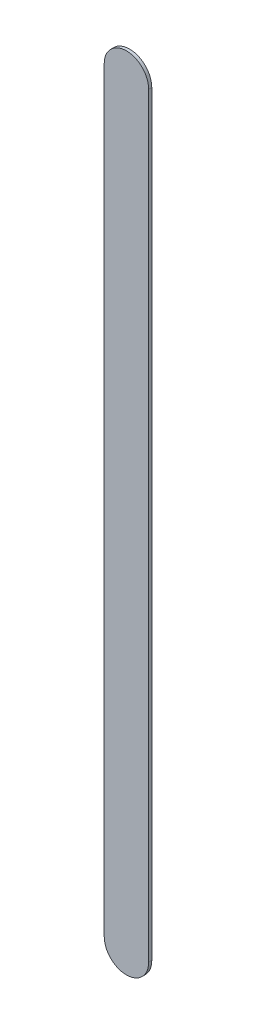
ISO-10303-21;
HEADER;
FILE_DESCRIPTION(('STEP AP214'),'2;1');
FILE_NAME('part.step','',(''),(''),'','','');
FILE_SCHEMA(('AUTOMOTIVE_DESIGN { 1 0 10303 214 1 1 1 1 }'));
ENDSEC;
DATA;
#1=APPLICATION_CONTEXT('core data for automotive mechanical design processes');
#2=APPLICATION_PROTOCOL_DEFINITION('international standard','automotive_design',2000,#1);
#3=PRODUCT_CONTEXT('',#1,'mechanical');
#4=PRODUCT('Part','Part','',(#3));
#5=PRODUCT_RELATED_PRODUCT_CATEGORY('part','',(#4));
#6=PRODUCT_DEFINITION_FORMATION('','',#4);
#7=PRODUCT_DEFINITION_CONTEXT('part definition',#1,'design');
#8=PRODUCT_DEFINITION('design','',#6,#7);
#9=PRODUCT_DEFINITION_SHAPE('','',#8);
#10=(LENGTH_UNIT() NAMED_UNIT(*) SI_UNIT(.MILLI.,.METRE.));
#11=(NAMED_UNIT(*) PLANE_ANGLE_UNIT() SI_UNIT($,.RADIAN.));
#12=(NAMED_UNIT(*) SI_UNIT($,.STERADIAN.) SOLID_ANGLE_UNIT());
#13=UNCERTAINTY_MEASURE_WITH_UNIT(LENGTH_MEASURE(1.E-05),#10,'distance_accuracy_value','');
#14=(GEOMETRIC_REPRESENTATION_CONTEXT(3) GLOBAL_UNCERTAINTY_ASSIGNED_CONTEXT((#13)) GLOBAL_UNIT_ASSIGNED_CONTEXT((#10,
#11,#12)) REPRESENTATION_CONTEXT('',''));
#15=CARTESIAN_POINT('',(0.,0.,0.));
#16=DIRECTION('',(0.,0.,1.));
#17=DIRECTION('',(1.,0.,0.));
#18=AXIS2_PLACEMENT_3D('',#15,#16,#17);
#19=CARTESIAN_POINT('',(137.62,-101.2,1.635));
#20=DIRECTION('',(0.,0.,1.));
#21=DIRECTION('',(1.,0.,0.));
#22=AXIS2_PLACEMENT_3D('',#19,#20,#21);
#23=PLANE('',#22);
#24=DIRECTION('',(0.,-1.,0.));
#25=VECTOR('',#24,1.);
#26=CARTESIAN_POINT('',(137.62,-101.2,1.635));
#27=LINE('',#26,#25);
#28=CARTESIAN_POINT('',(137.62,-101.2,1.635));
#29=VERTEX_POINT('',#28);
#30=CARTESIAN_POINT('',(137.62,-109.7,1.635));
#31=VERTEX_POINT('',#30);
#32=EDGE_CURVE('E81',#29,#31,#27,.T.);
#33=ORIENTED_EDGE('',*,*,#32,.T.);
#34=CARTESIAN_POINT('',(137.87,-109.7,1.635));
#35=DIRECTION('',(0.,0.,1.));
#36=DIRECTION('',(-1.,0.,0.));
#37=AXIS2_PLACEMENT_3D('',#34,#35,#36);
#38=CIRCLE('',#37,0.25);
#39=CARTESIAN_POINT('',(138.12,-109.7,1.635));
#40=VERTEX_POINT('',#39);
#41=EDGE_CURVE('E104',#31,#40,#38,.T.);
#42=ORIENTED_EDGE('',*,*,#41,.T.);
#43=DIRECTION('',(0.,1.,0.));
#44=VECTOR('',#43,1.);
#45=CARTESIAN_POINT('',(138.12,-109.7,1.635));
#46=LINE('',#45,#44);
#47=CARTESIAN_POINT('',(138.12,-101.2,1.635));
#48=VERTEX_POINT('',#47);
#49=EDGE_CURVE('E74',#40,#48,#46,.T.);
#50=ORIENTED_EDGE('',*,*,#49,.T.);
#51=CARTESIAN_POINT('',(137.87,-101.2,1.635));
#52=DIRECTION('',(0.,0.,1.));
#53=DIRECTION('',(1.,0.,0.));
#54=AXIS2_PLACEMENT_3D('',#51,#52,#53);
#55=CIRCLE('',#54,0.25);
#56=EDGE_CURVE('E11',#48,#29,#55,.T.);
#57=ORIENTED_EDGE('',*,*,#56,.T.);
#58=EDGE_LOOP('',(#33,#42,#50,#57));
#59=FACE_BOUND('',#58,.T.);
#60=ADVANCED_FACE('F17',(#59),#23,.T.);
#61=CARTESIAN_POINT('',(137.62,-101.2,1.6));
#62=DIRECTION('',(0.,0.,1.));
#63=DIRECTION('',(1.,0.,0.));
#64=AXIS2_PLACEMENT_3D('',#61,#62,#63);
#65=PLANE('',#64);
#66=CARTESIAN_POINT('',(137.87,-101.2,1.6));
#67=DIRECTION('',(0.,0.,1.));
#68=DIRECTION('',(1.,0.,0.));
#69=AXIS2_PLACEMENT_3D('',#66,#67,#68);
#70=CIRCLE('',#69,0.25);
#71=CARTESIAN_POINT('',(138.12,-101.2,1.6));
#72=VERTEX_POINT('',#71);
#73=CARTESIAN_POINT('',(137.62,-101.2,1.6));
#74=VERTEX_POINT('',#73);
#75=EDGE_CURVE('E25',#72,#74,#70,.T.);
#76=ORIENTED_EDGE('',*,*,#75,.F.);
#77=DIRECTION('',(0.,1.,0.));
#78=VECTOR('',#77,1.);
#79=CARTESIAN_POINT('',(138.12,-109.7,1.6));
#80=LINE('',#79,#78);
#81=CARTESIAN_POINT('',(138.12,-109.7,1.6));
#82=VERTEX_POINT('',#81);
#83=EDGE_CURVE('E108',#82,#72,#80,.T.);
#84=ORIENTED_EDGE('',*,*,#83,.F.);
#85=CARTESIAN_POINT('',(137.87,-109.7,1.6));
#86=DIRECTION('',(0.,0.,1.));
#87=DIRECTION('',(-1.,0.,0.));
#88=AXIS2_PLACEMENT_3D('',#85,#86,#87);
#89=CIRCLE('',#88,0.25);
#90=CARTESIAN_POINT('',(137.62,-109.7,1.6));
#91=VERTEX_POINT('',#90);
#92=EDGE_CURVE('E83',#91,#82,#89,.T.);
#93=ORIENTED_EDGE('',*,*,#92,.F.);
#94=DIRECTION('',(0.,-1.,0.));
#95=VECTOR('',#94,1.);
#96=CARTESIAN_POINT('',(137.62,-101.2,1.6));
#97=LINE('',#96,#95);
#98=EDGE_CURVE('E79',#74,#91,#97,.T.);
#99=ORIENTED_EDGE('',*,*,#98,.F.);
#100=EDGE_LOOP('',(#76,#84,#93,#99));
#101=FACE_BOUND('',#100,.T.);
#102=ADVANCED_FACE('F85',(#101),#65,.F.);
#103=CARTESIAN_POINT('',(137.87,-101.2,1.6));
#104=DIRECTION('',(0.,0.,-1.));
#105=DIRECTION('',(1.,0.,0.));
#106=AXIS2_PLACEMENT_3D('',#103,#104,#105);
#107=CYLINDRICAL_SURFACE('',#106,0.25);
#108=ORIENTED_EDGE('',*,*,#75,.T.);
#109=DIRECTION('',(0.,0.,1.));
#110=VECTOR('',#109,1.);
#111=CARTESIAN_POINT('',(137.62,-101.2,1.6));
#112=LINE('',#111,#110);
#113=EDGE_CURVE('E68',#74,#29,#112,.T.);
#114=ORIENTED_EDGE('',*,*,#113,.T.);
#115=ORIENTED_EDGE('',*,*,#56,.F.);
#116=DIRECTION('',(0.,0.,1.));
#117=VECTOR('',#116,1.);
#118=CARTESIAN_POINT('',(138.12,-101.2,1.6));
#119=LINE('',#118,#117);
#120=EDGE_CURVE('E71',#72,#48,#119,.T.);
#121=ORIENTED_EDGE('',*,*,#120,.F.);
#122=EDGE_LOOP('',(#108,#114,#115,#121));
#123=FACE_BOUND('',#122,.T.);
#124=ADVANCED_FACE('F67',(#123),#107,.T.);
#125=CARTESIAN_POINT('',(138.12,-109.7,1.6));
#126=DIRECTION('',(-1.,0.,0.));
#127=DIRECTION('',(0.,0.,1.));
#128=AXIS2_PLACEMENT_3D('',#125,#126,#127);
#129=PLANE('',#128);
#130=ORIENTED_EDGE('',*,*,#83,.T.);
#131=ORIENTED_EDGE('',*,*,#120,.T.);
#132=ORIENTED_EDGE('',*,*,#49,.F.);
#133=DIRECTION('',(0.,0.,1.));
#134=VECTOR('',#133,1.);
#135=CARTESIAN_POINT('',(138.12,-109.7,1.6));
#136=LINE('',#135,#134);
#137=EDGE_CURVE('E100',#82,#40,#136,.T.);
#138=ORIENTED_EDGE('',*,*,#137,.F.);
#139=EDGE_LOOP('',(#130,#131,#132,#138));
#140=FACE_BOUND('',#139,.T.);
#141=ADVANCED_FACE('F117',(#140),#129,.F.);
#142=CARTESIAN_POINT('',(137.87,-109.7,1.6));
#143=DIRECTION('',(0.,0.,-1.));
#144=DIRECTION('',(-1.,0.,0.));
#145=AXIS2_PLACEMENT_3D('',#142,#143,#144);
#146=CYLINDRICAL_SURFACE('',#145,0.25);
#147=ORIENTED_EDGE('',*,*,#92,.T.);
#148=ORIENTED_EDGE('',*,*,#137,.T.);
#149=ORIENTED_EDGE('',*,*,#41,.F.);
#150=DIRECTION('',(0.,0.,1.));
#151=VECTOR('',#150,1.);
#152=CARTESIAN_POINT('',(137.62,-109.7,1.6));
#153=LINE('',#152,#151);
#154=EDGE_CURVE('E89',#91,#31,#153,.T.);
#155=ORIENTED_EDGE('',*,*,#154,.F.);
#156=EDGE_LOOP('',(#147,#148,#149,#155));
#157=FACE_BOUND('',#156,.T.);
#158=ADVANCED_FACE('F120',(#157),#146,.T.);
#159=CARTESIAN_POINT('',(137.62,-101.2,1.6));
#160=DIRECTION('',(1.,0.,0.));
#161=DIRECTION('',(0.,1.,0.));
#162=AXIS2_PLACEMENT_3D('',#159,#160,#161);
#163=PLANE('',#162);
#164=ORIENTED_EDGE('',*,*,#98,.T.);
#165=ORIENTED_EDGE('',*,*,#154,.T.);
#166=ORIENTED_EDGE('',*,*,#32,.F.);
#167=ORIENTED_EDGE('',*,*,#113,.F.);
#168=EDGE_LOOP('',(#164,#165,#166,#167));
#169=FACE_BOUND('',#168,.T.);
#170=ADVANCED_FACE('F77',(#169),#163,.F.);
#171=CLOSED_SHELL('',(#60,#102,#124,#141,#158,#170));
#172=MANIFOLD_SOLID_BREP('B1',#171);
#173=ADVANCED_BREP_SHAPE_REPRESENTATION('',(#18,#172),#14);
#174=SHAPE_DEFINITION_REPRESENTATION(#9,#173);
ENDSEC;
END-ISO-10303-21;
